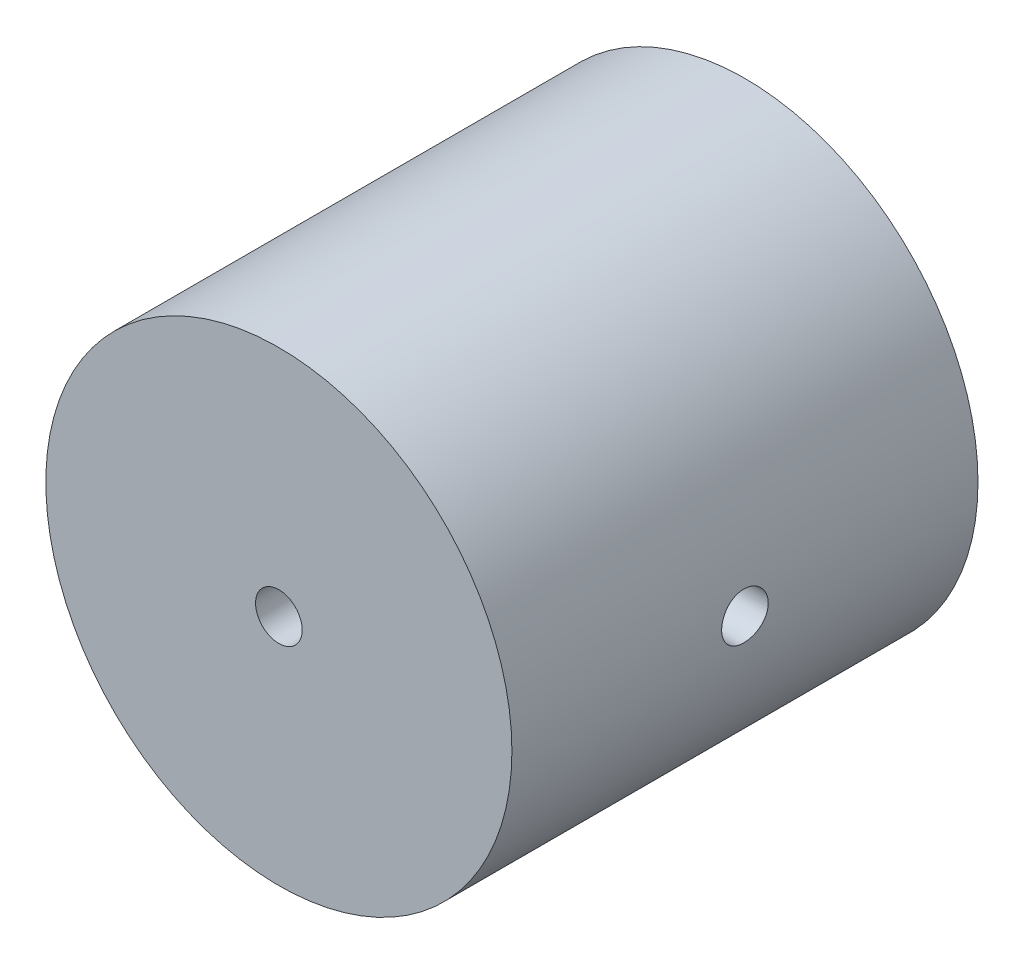
ISO-10303-21;
HEADER;
FILE_DESCRIPTION(('STEP AP214'),'2;1');
FILE_NAME('part.step','',(''),(''),'','','');
FILE_SCHEMA(('AUTOMOTIVE_DESIGN { 1 0 10303 214 1 1 1 1 }'));
ENDSEC;
DATA;
#1=APPLICATION_CONTEXT('core data for automotive mechanical design processes');
#2=APPLICATION_PROTOCOL_DEFINITION('international standard','automotive_design',2000,#1);
#3=PRODUCT_CONTEXT('',#1,'mechanical');
#4=PRODUCT('Part','Part','',(#3));
#5=PRODUCT_RELATED_PRODUCT_CATEGORY('part','',(#4));
#6=PRODUCT_DEFINITION_FORMATION('','',#4);
#7=PRODUCT_DEFINITION_CONTEXT('part definition',#1,'design');
#8=PRODUCT_DEFINITION('design','',#6,#7);
#9=PRODUCT_DEFINITION_SHAPE('','',#8);
#10=(LENGTH_UNIT() NAMED_UNIT(*) SI_UNIT(.MILLI.,.METRE.));
#11=(NAMED_UNIT(*) PLANE_ANGLE_UNIT() SI_UNIT($,.RADIAN.));
#12=(NAMED_UNIT(*) SI_UNIT($,.STERADIAN.) SOLID_ANGLE_UNIT());
#13=UNCERTAINTY_MEASURE_WITH_UNIT(LENGTH_MEASURE(1.E-05),#10,'distance_accuracy_value','');
#14=(GEOMETRIC_REPRESENTATION_CONTEXT(3) GLOBAL_UNCERTAINTY_ASSIGNED_CONTEXT((#13)) GLOBAL_UNIT_ASSIGNED_CONTEXT((#10,
#11,#12)) REPRESENTATION_CONTEXT('',''));
#15=CARTESIAN_POINT('',(0.,0.,0.));
#16=DIRECTION('',(0.,0.,1.));
#17=DIRECTION('',(1.,0.,0.));
#18=AXIS2_PLACEMENT_3D('',#15,#16,#17);
#19=CARTESIAN_POINT('',(0.,0.,4.75));
#20=DIRECTION('',(0.,0.,1.));
#21=DIRECTION('',(1.,0.,0.));
#22=AXIS2_PLACEMENT_3D('',#19,#20,#21);
#23=PLANE('',#22);
#24=CARTESIAN_POINT('',(0.,0.,4.75));
#25=DIRECTION('',(0.,0.,1.));
#26=DIRECTION('',(1.,0.,0.));
#27=AXIS2_PLACEMENT_3D('',#24,#25,#26);
#28=CIRCLE('',#27,0.5);
#29=CARTESIAN_POINT('',(0.5,0.,4.75));
#30=VERTEX_POINT('',#29);
#31=EDGE_CURVE('E132',#30,#30,#28,.T.);
#32=ORIENTED_EDGE('',*,*,#31,.F.);
#33=EDGE_LOOP('',(#32));
#34=FACE_BOUND('',#33,.T.);
#35=CARTESIAN_POINT('',(0.,0.,4.75));
#36=DIRECTION('',(0.,0.,1.));
#37=DIRECTION('',(1.,0.,0.));
#38=AXIS2_PLACEMENT_3D('',#35,#36,#37);
#39=CIRCLE('',#38,4.49999999999988);
#40=CARTESIAN_POINT('',(-3.50000000000012,-2.82842712474584,4.75000000000001));
#41=VERTEX_POINT('',#40);
#42=CARTESIAN_POINT('',(3.49999999999988,-2.82842712474615,4.75));
#43=VERTEX_POINT('',#42);
#44=EDGE_CURVE('E11',#41,#43,#39,.T.);
#45=ORIENTED_EDGE('',*,*,#44,.T.);
#46=DIRECTION('',(0.,1.,0.));
#47=VECTOR('',#46,1.);
#48=CARTESIAN_POINT('',(3.49999999999988,0.,4.75));
#49=LINE('',#48,#47);
#50=CARTESIAN_POINT('',(3.49999999999988,2.82842712474615,4.75000000000001));
#51=VERTEX_POINT('',#50);
#52=EDGE_CURVE('E101',#43,#51,#49,.T.);
#53=ORIENTED_EDGE('',*,*,#52,.T.);
#54=CARTESIAN_POINT('',(0.,0.,4.75));
#55=DIRECTION('',(0.,0.,1.));
#56=DIRECTION('',(1.,0.,0.));
#57=AXIS2_PLACEMENT_3D('',#54,#55,#56);
#58=CIRCLE('',#57,4.49999999999988);
#59=CARTESIAN_POINT('',(-3.50000000000012,2.82842712474584,4.75000000000001));
#60=VERTEX_POINT('',#59);
#61=EDGE_CURVE('E61',#51,#60,#58,.T.);
#62=ORIENTED_EDGE('',*,*,#61,.T.);
#63=DIRECTION('',(0.,1.,0.));
#64=VECTOR('',#63,1.);
#65=CARTESIAN_POINT('',(-3.50000000000012,0.,4.75));
#66=LINE('',#65,#64);
#67=EDGE_CURVE('E69',#41,#60,#66,.T.);
#68=ORIENTED_EDGE('',*,*,#67,.F.);
#69=EDGE_LOOP('',(#45,#53,#62,#68));
#70=FACE_BOUND('',#69,.T.);
#71=ADVANCED_FACE('F43',(#34,#70),#23,.T.);
#72=CARTESIAN_POINT('',(0.,0.,10.75));
#73=DIRECTION('',(0.,0.,-1.));
#74=DIRECTION('',(1.,0.,0.));
#75=AXIS2_PLACEMENT_3D('',#72,#73,#74);
#76=PLANE('',#75);
#77=CARTESIAN_POINT('',(0.,0.,10.75));
#78=DIRECTION('',(0.,0.,-1.));
#79=DIRECTION('',(-1.,0.,0.));
#80=AXIS2_PLACEMENT_3D('',#77,#78,#79);
#81=CIRCLE('',#80,0.5);
#82=CARTESIAN_POINT('',(-0.5,0.,10.75));
#83=VERTEX_POINT('',#82);
#84=EDGE_CURVE('E139',#83,#83,#81,.T.);
#85=ORIENTED_EDGE('',*,*,#84,.F.);
#86=EDGE_LOOP('',(#85));
#87=FACE_BOUND('',#86,.T.);
#88=DIRECTION('',(0.,-1.,0.));
#89=VECTOR('',#88,1.);
#90=CARTESIAN_POINT('',(3.49999999999988,0.,10.75));
#91=LINE('',#90,#89);
#92=CARTESIAN_POINT('',(3.49999999999988,2.82842712474615,10.75));
#93=VERTEX_POINT('',#92);
#94=CARTESIAN_POINT('',(3.49999999999988,-2.82842712474615,10.75));
#95=VERTEX_POINT('',#94);
#96=EDGE_CURVE('E113',#93,#95,#91,.T.);
#97=ORIENTED_EDGE('',*,*,#96,.T.);
#98=CARTESIAN_POINT('',(0.,0.,10.75));
#99=DIRECTION('',(0.,0.,-1.));
#100=DIRECTION('',(-1.,0.,0.));
#101=AXIS2_PLACEMENT_3D('',#98,#99,#100);
#102=CIRCLE('',#101,4.49999999999988);
#103=CARTESIAN_POINT('',(-3.50000000000012,-2.82842712474584,10.75));
#104=VERTEX_POINT('',#103);
#105=EDGE_CURVE('E94',#95,#104,#102,.T.);
#106=ORIENTED_EDGE('',*,*,#105,.T.);
#107=DIRECTION('',(0.,-1.,0.));
#108=VECTOR('',#107,1.);
#109=CARTESIAN_POINT('',(-3.50000000000012,0.,10.75));
#110=LINE('',#109,#108);
#111=CARTESIAN_POINT('',(-3.50000000000012,2.82842712474584,10.75));
#112=VERTEX_POINT('',#111);
#113=EDGE_CURVE('E117',#112,#104,#110,.T.);
#114=ORIENTED_EDGE('',*,*,#113,.F.);
#115=CARTESIAN_POINT('',(0.,0.,10.75));
#116=DIRECTION('',(0.,0.,-1.));
#117=DIRECTION('',(-1.,0.,0.));
#118=AXIS2_PLACEMENT_3D('',#115,#116,#117);
#119=CIRCLE('',#118,4.49999999999988);
#120=EDGE_CURVE('E115',#112,#93,#119,.T.);
#121=ORIENTED_EDGE('',*,*,#120,.T.);
#122=EDGE_LOOP('',(#97,#106,#114,#121));
#123=FACE_BOUND('',#122,.T.);
#124=ADVANCED_FACE('F178',(#87,#123),#76,.T.);
#125=CARTESIAN_POINT('',(0.,0.,24.8921356237306));
#126=DIRECTION('',(0.,0.,-1.));
#127=DIRECTION('',(-1.,0.,0.));
#128=AXIS2_PLACEMENT_3D('',#125,#126,#127);
#129=CYLINDRICAL_SURFACE('',#128,4.49999999999988);
#130=ORIENTED_EDGE('',*,*,#44,.F.);
#131=DIRECTION('',(0.,0.,-1.));
#132=VECTOR('',#131,1.);
#133=CARTESIAN_POINT('',(-3.50000000000012,-2.82842712474584,24.8921356237306));
#134=LINE('',#133,#132);
#135=EDGE_CURVE('E118',#104,#41,#134,.T.);
#136=ORIENTED_EDGE('',*,*,#135,.F.);
#137=ORIENTED_EDGE('',*,*,#105,.F.);
#138=DIRECTION('',(0.,0.,-1.));
#139=VECTOR('',#138,1.);
#140=CARTESIAN_POINT('',(3.49999999999988,-2.82842712474615,24.8921356237306));
#141=LINE('',#140,#139);
#142=EDGE_CURVE('E90',#95,#43,#141,.T.);
#143=ORIENTED_EDGE('',*,*,#142,.T.);
#144=EDGE_LOOP('',(#130,#136,#137,#143));
#145=FACE_BOUND('',#144,.T.);
#146=ADVANCED_FACE('F92',(#145),#129,.F.);
#147=CARTESIAN_POINT('',(-3.50000000000012,0.,24.8921356237306));
#148=DIRECTION('',(-1.,0.,0.));
#149=DIRECTION('',(0.,0.,1.));
#150=AXIS2_PLACEMENT_3D('',#147,#148,#149);
#151=PLANE('',#150);
#152=CARTESIAN_POINT('',(-3.50000000000013,0.,7.75));
#153=DIRECTION('',(-1.,0.,0.));
#154=DIRECTION('',(0.,0.,1.));
#155=AXIS2_PLACEMENT_3D('',#152,#153,#154);
#156=CIRCLE('',#155,0.500000000000001);
#157=CARTESIAN_POINT('',(-3.50000000000013,0.,8.25));
#158=VERTEX_POINT('',#157);
#159=EDGE_CURVE('E131',#158,#158,#156,.T.);
#160=ORIENTED_EDGE('',*,*,#159,.T.);
#161=EDGE_LOOP('',(#160));
#162=FACE_BOUND('',#161,.T.);
#163=ORIENTED_EDGE('',*,*,#135,.T.);
#164=ORIENTED_EDGE('',*,*,#67,.T.);
#165=DIRECTION('',(0.,0.,-1.));
#166=VECTOR('',#165,1.);
#167=CARTESIAN_POINT('',(-3.50000000000012,2.82842712474584,24.8921356237306));
#168=LINE('',#167,#166);
#169=EDGE_CURVE('E125',#112,#60,#168,.T.);
#170=ORIENTED_EDGE('',*,*,#169,.F.);
#171=ORIENTED_EDGE('',*,*,#113,.T.);
#172=EDGE_LOOP('',(#163,#164,#170,#171));
#173=FACE_BOUND('',#172,.T.);
#174=ADVANCED_FACE('F190',(#162,#173),#151,.F.);
#175=CARTESIAN_POINT('',(0.,0.,24.8921356237306));
#176=DIRECTION('',(0.,0.,-1.));
#177=DIRECTION('',(-1.,0.,0.));
#178=AXIS2_PLACEMENT_3D('',#175,#176,#177);
#179=CYLINDRICAL_SURFACE('',#178,4.49999999999988);
#180=ORIENTED_EDGE('',*,*,#61,.F.);
#181=DIRECTION('',(0.,0.,-1.));
#182=VECTOR('',#181,1.);
#183=CARTESIAN_POINT('',(3.49999999999988,2.82842712474615,24.8921356237306));
#184=LINE('',#183,#182);
#185=EDGE_CURVE('E97',#93,#51,#184,.T.);
#186=ORIENTED_EDGE('',*,*,#185,.F.);
#187=ORIENTED_EDGE('',*,*,#120,.F.);
#188=ORIENTED_EDGE('',*,*,#169,.T.);
#189=EDGE_LOOP('',(#180,#186,#187,#188));
#190=FACE_BOUND('',#189,.T.);
#191=ADVANCED_FACE('F186',(#190),#179,.F.);
#192=CARTESIAN_POINT('',(3.49999999999988,0.,24.8921356237306));
#193=DIRECTION('',(-1.,0.,0.));
#194=DIRECTION('',(0.,0.,1.));
#195=AXIS2_PLACEMENT_3D('',#192,#193,#194);
#196=PLANE('',#195);
#197=CARTESIAN_POINT('',(3.49999999999988,0.,7.75));
#198=DIRECTION('',(-1.,0.,0.));
#199=DIRECTION('',(0.,0.,1.));
#200=AXIS2_PLACEMENT_3D('',#197,#198,#199);
#201=CIRCLE('',#200,0.500000000000001);
#202=CARTESIAN_POINT('',(3.49999999999988,0.,8.25));
#203=VERTEX_POINT('',#202);
#204=EDGE_CURVE('E129',#203,#203,#201,.T.);
#205=ORIENTED_EDGE('',*,*,#204,.F.);
#206=EDGE_LOOP('',(#205));
#207=FACE_BOUND('',#206,.T.);
#208=ORIENTED_EDGE('',*,*,#52,.F.);
#209=ORIENTED_EDGE('',*,*,#142,.F.);
#210=ORIENTED_EDGE('',*,*,#96,.F.);
#211=ORIENTED_EDGE('',*,*,#185,.T.);
#212=EDGE_LOOP('',(#208,#209,#210,#211));
#213=FACE_BOUND('',#212,.T.);
#214=ADVANCED_FACE('F102',(#207,#213),#196,.T.);
#215=CARTESIAN_POINT('',(99.9999999999999,0.,7.74999999999998));
#216=DIRECTION('',(-1.,0.,0.));
#217=DIRECTION('',(0.,0.,1.));
#218=AXIS2_PLACEMENT_3D('',#215,#216,#217);
#219=CYLINDRICAL_SURFACE('',#218,0.500000000000001);
#220=ORIENTED_EDGE('',*,*,#204,.T.);
#221=EDGE_LOOP('',(#220));
#222=FACE_BOUND('',#221,.T.);
#223=CARTESIAN_POINT('',(4.99999999999988,0.,8.25));
#224=CARTESIAN_POINT('',(4.99999967760373,0.0280101768957787,8.24999878704981));
#225=CARTESIAN_POINT('',(4.99976212798091,0.0560388725838867,8.24763836555178));
#226=CARTESIAN_POINT('',(4.99883733797357,0.111319199248419,8.23825781485479));
#227=CARTESIAN_POINT('',(4.99814960217001,0.138569939584414,8.2312325519877));
#228=CARTESIAN_POINT('',(4.99640207281523,0.191485837726708,8.21272887970108));
#229=CARTESIAN_POINT('',(4.99534250400342,0.217151942307455,8.20125315974076));
#230=CARTESIAN_POINT('',(4.99296978697141,0.266188080480204,8.17417954603418));
#231=CARTESIAN_POINT('',(4.99165668919054,0.289558569389539,8.15858247199993));
#232=CARTESIAN_POINT('',(4.9889187217065,0.333429775337042,8.12364865116886));
#233=CARTESIAN_POINT('',(4.98749350786921,0.353921072417448,8.10430010029898));
#234=CARTESIAN_POINT('',(4.98469478453119,0.391371260715494,8.06243773286848));
#235=CARTESIAN_POINT('',(4.98332127742446,0.408329988541328,8.0399237699788));
#236=CARTESIAN_POINT('',(4.9807779577638,0.43826698522181,7.99231073415819));
#237=CARTESIAN_POINT('',(4.9796085835544,0.451236732727441,7.96720627795257));
#238=CARTESIAN_POINT('',(4.9776101877325,0.472773192371381,7.91516220704751));
#239=CARTESIAN_POINT('',(4.97678115771099,0.481340013295647,7.88822263770802));
#240=CARTESIAN_POINT('',(4.97556042036477,0.493799520800948,7.83336909956699));
#241=CARTESIAN_POINT('',(4.97516725199036,0.497707826501898,7.80545871157389));
#242=CARTESIAN_POINT('',(4.97485821530251,0.500787642567681,7.74937556830211));
#243=CARTESIAN_POINT('',(4.97494233444361,0.499959277435401,7.72120281993897));
#244=CARTESIAN_POINT('',(4.97557703449455,0.49360214012634,7.66550234515334));
#245=CARTESIAN_POINT('',(4.97612592295313,0.488090422062276,7.63797265033565));
#246=CARTESIAN_POINT('',(4.97762567143697,0.472549572075294,7.58423101839945));
#247=CARTESIAN_POINT('',(4.97857653689234,0.462520379127873,7.55801909908748));
#248=CARTESIAN_POINT('',(4.98077504726023,0.438210446940754,7.50760320635055));
#249=CARTESIAN_POINT('',(4.98202321954067,0.42392214135999,7.48340290525534));
#250=CARTESIAN_POINT('',(4.98467525866427,0.391505013676614,7.43773739254406));
#251=CARTESIAN_POINT('',(4.9860791300638,0.373376079168253,7.41627226100912));
#252=CARTESIAN_POINT('',(4.98889192656483,0.333697056206035,7.37658730300548));
#253=CARTESIAN_POINT('',(4.99030084666487,0.312132239425682,7.3583821990596));
#254=CARTESIAN_POINT('',(4.99295914539247,0.266244740868556,7.3258481835448));
#255=CARTESIAN_POINT('',(4.99420852384116,0.2419220559998,7.31151927632176));
#256=CARTESIAN_POINT('',(4.99640737833536,0.191199052846182,7.28714498984487));
#257=CARTESIAN_POINT('',(4.99735680207373,0.164798373194951,7.27710035759097));
#258=CARTESIAN_POINT('',(4.99884823720692,0.110673608664965,7.26159054164412));
#259=CARTESIAN_POINT('',(4.9993902607852,0.0829495633882996,7.25612522100469));
#260=CARTESIAN_POINT('',(5.00000425834143,0.0270925495459513,7.24994784613262));
#261=CARTESIAN_POINT('',(5.00007824133856,-0.00103815105274658,7.24921547587375));
#262=CARTESIAN_POINT('',(4.99975320878386,-0.0570218966578505,7.25247143152438));
#263=CARTESIAN_POINT('',(4.99935419962222,-0.0848749454102356,7.25645969365764));
#264=CARTESIAN_POINT('',(4.99812930769585,-0.139454103417338,7.26902684771079));
#265=CARTESIAN_POINT('',(4.99730430959008,-0.16618242448601,7.277596227239));
#266=CARTESIAN_POINT('',(4.99531999430293,-0.217822160691892,7.29907258701863));
#267=CARTESIAN_POINT('',(4.99416066962615,-0.242733535078559,7.3119796645197));
#268=CARTESIAN_POINT('',(4.99163237665199,-0.290124090086072,7.34181541933196));
#269=CARTESIAN_POINT('',(4.99026271801708,-0.312594829874459,7.35875744446291));
#270=CARTESIAN_POINT('',(4.98746966434748,-0.35438081165594,7.39616303387046));
#271=CARTESIAN_POINT('',(4.98604626796474,-0.373695974424589,7.41662668653516));
#272=CARTESIAN_POINT('',(4.98330012070365,-0.408693054943573,7.4605832873295));
#273=CARTESIAN_POINT('',(4.98197775069476,-0.424361639339772,7.48408687827131));
#274=CARTESIAN_POINT('',(4.97958916230433,-0.451529129371914,7.53340368007334));
#275=CARTESIAN_POINT('',(4.97852294042007,-0.463028092026942,7.5592168593442));
#276=CARTESIAN_POINT('',(4.97676973817013,-0.481507604342238,7.6123743697329));
#277=CARTESIAN_POINT('',(4.97608209224882,-0.488496087405932,7.63971592004556));
#278=CARTESIAN_POINT('',(4.97516182641426,-0.497782003564732,7.69519159898039));
#279=CARTESIAN_POINT('',(4.97492919345081,-0.500079571199759,7.72332570484784));
#280=CARTESIAN_POINT('',(4.97494556553769,-0.499916569235629,7.77945534417835));
#281=CARTESIAN_POINT('',(4.97519245043492,-0.497476944796557,7.80745094144141));
#282=CARTESIAN_POINT('',(4.97613551944761,-0.487952726481827,7.86263245858414));
#283=CARTESIAN_POINT('',(4.97683170406847,-0.48086812738108,7.88981837755299));
#284=CARTESIAN_POINT('',(4.97859434131581,-0.462260843148752,7.94260867452393));
#285=CARTESIAN_POINT('',(4.97966074270168,-0.450738772170459,7.96821327081486));
#286=CARTESIAN_POINT('',(4.98204375919667,-0.423585777455523,8.01712844583552));
#287=CARTESIAN_POINT('',(4.98336037290463,-0.407954876727708,8.04043903741031));
#288=CARTESIAN_POINT('',(4.98610243604837,-0.372949278142667,8.08421183723597));
#289=CARTESIAN_POINT('',(4.98752832363363,-0.353558974445135,8.10466153818354));
#290=CARTESIAN_POINT('',(4.99032427364379,-0.311615849612556,8.14202611634983));
#291=CARTESIAN_POINT('',(4.99169432261476,-0.28906227205413,8.15894014567858));
#292=CARTESIAN_POINT('',(4.99422781034569,-0.241370717080646,8.18878672692731));
#293=CARTESIAN_POINT('',(4.99539072013394,-0.216226374673383,8.20170914547259));
#294=CARTESIAN_POINT('',(4.99737314624936,-0.164129139550276,8.22313121141193));
#295=CARTESIAN_POINT('',(4.99819304954815,-0.137178324912805,8.23163584547678));
#296=CARTESIAN_POINT('',(4.99919106886855,-0.0917291307028525,8.2418603085424));
#297=CARTESIAN_POINT('',(4.99949300345904,-0.0735212764222545,8.24490852214968));
#298=CARTESIAN_POINT('',(4.99989757475381,-0.0368782904086564,8.24897876303088));
#299=CARTESIAN_POINT('',(5.00000021228,-0.0184431596132789,8.25000079866093));
#300=CARTESIAN_POINT('',(4.99999999999988,0.,8.25));
#301=B_SPLINE_CURVE_WITH_KNOTS('',3,(#223,#224,#225,#226,#227,#228,#229,#230,#231,#232,#233,
#234,#235,#236,#237,#238,#239,#240,#241,#242,#243,#244,#245,#246,#247,#248,#249,#250,#251,#252,
#253,#254,#255,#256,#257,#258,#259,#260,#261,#262,#263,#264,#265,#266,#267,#268,#269,#270,#271,
#272,#273,#274,#275,#276,#277,#278,#279,#280,#281,#282,#283,#284,#285,#286,#287,#288,#289,#290,
#291,#292,#293,#294,#295,#296,#297,#298,#299,#300),.UNSPECIFIED.,.T.,.F.,(4,2,2,2,2,2,2,2,2,2,2,
2,2,2,2,2,2,2,2,2,2,2,2,2,2,2,2,2,2,2,2,2,2,2,2,2,2,2,4),(0.,0.0839631831342372,
0.168018921417744,0.252023942866102,0.336012268791392,0.420269284311475,0.504530196103531,
0.588969877361112,0.673407472212523,0.757561160225985,0.841712636278884,0.925558987205556,
1.00940647080817,1.09340380686448,1.17740360165563,1.26177367098104,1.34614383489886,
1.43052870346791,1.5149110483772,1.59893094303879,1.68294970259572,1.76679467647153,
1.85064153024734,1.93476970374349,2.01889998905115,2.10333321804299,2.18776529237687,
2.27204845296502,2.35632919619793,2.44023814646979,2.5241471911302,2.608044626814,
2.6919415926948,2.77619458713827,2.86046776318479,2.94495315513121,3.02934297397648,
3.08462833616175,3.13991347034514),.UNSPECIFIED.);
#302=CARTESIAN_POINT('',(4.99999999999988,0.,8.25));
#303=VERTEX_POINT('',#302);
#304=EDGE_CURVE('E136',#303,#303,#301,.T.);
#305=ORIENTED_EDGE('',*,*,#304,.F.);
#306=EDGE_LOOP('',(#305));
#307=FACE_BOUND('',#306,.T.);
#308=ADVANCED_FACE('F163',(#222,#307),#219,.F.);
#309=ORIENTED_EDGE('',*,*,#159,.F.);
#310=EDGE_LOOP('',(#309));
#311=FACE_BOUND('',#310,.T.);
#312=CARTESIAN_POINT('',(-4.99999999999988,0.,7.25));
#313=CARTESIAN_POINT('',(-4.99999967760373,0.0280101768957787,7.25000121295019));
#314=CARTESIAN_POINT('',(-4.99976212798091,0.0560388725838866,7.25236163444822));
#315=CARTESIAN_POINT('',(-4.99883733797357,0.111319199248419,7.26174218514521));
#316=CARTESIAN_POINT('',(-4.99814960217001,0.138569939584414,7.26876744801229));
#317=CARTESIAN_POINT('',(-4.99640207281523,0.191485837726707,7.28727112029892));
#318=CARTESIAN_POINT('',(-4.99534250400342,0.217151942307455,7.29874684025924));
#319=CARTESIAN_POINT('',(-4.99296978697141,0.266188080480203,7.32582045396582));
#320=CARTESIAN_POINT('',(-4.99165668919054,0.289558569389539,7.34141752800007));
#321=CARTESIAN_POINT('',(-4.9889187217065,0.333429775337042,7.37635134883114));
#322=CARTESIAN_POINT('',(-4.98749350786921,0.353921072417447,7.39569989970102));
#323=CARTESIAN_POINT('',(-4.98469478453119,0.391371260715493,7.43756226713151));
#324=CARTESIAN_POINT('',(-4.98332127742446,0.408329988541327,7.46007623002119));
#325=CARTESIAN_POINT('',(-4.9807779577638,0.438266985221809,7.50768926584181));
#326=CARTESIAN_POINT('',(-4.9796085835544,0.45123673272744,7.53279372204743));
#327=CARTESIAN_POINT('',(-4.9776101877325,0.472773192371381,7.58483779295249));
#328=CARTESIAN_POINT('',(-4.97678115771099,0.481340013295646,7.61177736229198));
#329=CARTESIAN_POINT('',(-4.97556042036477,0.493799520800948,7.66663090043301));
#330=CARTESIAN_POINT('',(-4.97516725199036,0.497707826501898,7.6945412884261));
#331=CARTESIAN_POINT('',(-4.97485821530251,0.500787642567681,7.75062443169789));
#332=CARTESIAN_POINT('',(-4.97494233444361,0.499959277435401,7.77879718006103));
#333=CARTESIAN_POINT('',(-4.97557703449455,0.49360214012634,7.83449765484666));
#334=CARTESIAN_POINT('',(-4.97612592295313,0.488090422062277,7.86202734966435));
#335=CARTESIAN_POINT('',(-4.97762567143697,0.472549572075294,7.91576898160055));
#336=CARTESIAN_POINT('',(-4.97857653689234,0.462520379127873,7.94198090091252));
#337=CARTESIAN_POINT('',(-4.98077504726023,0.438210446940754,7.99239679364945));
#338=CARTESIAN_POINT('',(-4.98202321954067,0.423922141359991,8.01659709474466));
#339=CARTESIAN_POINT('',(-4.98467525866427,0.391505013676615,8.06226260745594));
#340=CARTESIAN_POINT('',(-4.9860791300638,0.373376079168254,8.08372773899088));
#341=CARTESIAN_POINT('',(-4.98889192656483,0.333697056206035,8.12341269699451));
#342=CARTESIAN_POINT('',(-4.99030084666487,0.312132239425682,8.1416178009404));
#343=CARTESIAN_POINT('',(-4.99295914539247,0.266244740868556,8.1741518164552));
#344=CARTESIAN_POINT('',(-4.99420852384116,0.2419220559998,8.18848072367824));
#345=CARTESIAN_POINT('',(-4.99640737833536,0.191199052846183,8.21285501015513));
#346=CARTESIAN_POINT('',(-4.99735680207373,0.164798373194952,8.22289964240903));
#347=CARTESIAN_POINT('',(-4.99884823720692,0.110673608664967,8.23840945835588));
#348=CARTESIAN_POINT('',(-4.9993902607852,0.0829495633883011,8.24387477899531));
#349=CARTESIAN_POINT('',(-5.00000425834143,0.0270925495459526,8.25005215386738));
#350=CARTESIAN_POINT('',(-5.00007824133856,-0.00103815105274545,8.25078452412625));
#351=CARTESIAN_POINT('',(-4.99975320878386,-0.0570218966578497,8.24752856847562));
#352=CARTESIAN_POINT('',(-4.99935419962222,-0.0848749454102348,8.24354030634236));
#353=CARTESIAN_POINT('',(-4.99812930769585,-0.139454103417337,8.23097315228921));
#354=CARTESIAN_POINT('',(-4.99730430959008,-0.16618242448601,8.22240377276099));
#355=CARTESIAN_POINT('',(-4.99531999430293,-0.217822160691891,8.20092741298136));
#356=CARTESIAN_POINT('',(-4.99416066962615,-0.242733535078558,8.1880203354803));
#357=CARTESIAN_POINT('',(-4.99163237665199,-0.290124090086071,8.15818458066804));
#358=CARTESIAN_POINT('',(-4.99026271801708,-0.312594829874459,8.14124255553709));
#359=CARTESIAN_POINT('',(-4.98746966434748,-0.35438081165594,8.10383696612954));
#360=CARTESIAN_POINT('',(-4.98604626796474,-0.373695974424589,8.08337331346484));
#361=CARTESIAN_POINT('',(-4.98330012070365,-0.408693054943573,8.0394167126705));
#362=CARTESIAN_POINT('',(-4.98197775069476,-0.424361639339772,8.01591312172869));
#363=CARTESIAN_POINT('',(-4.97958916230433,-0.451529129371914,7.96659631992666));
#364=CARTESIAN_POINT('',(-4.97852294042007,-0.463028092026942,7.9407831406558));
#365=CARTESIAN_POINT('',(-4.97676973817013,-0.481507604342238,7.88762563026711));
#366=CARTESIAN_POINT('',(-4.97608209224882,-0.488496087405931,7.86028407995444));
#367=CARTESIAN_POINT('',(-4.97516182641426,-0.497782003564732,7.80480840101961));
#368=CARTESIAN_POINT('',(-4.97492919345081,-0.500079571199759,7.77667429515216));
#369=CARTESIAN_POINT('',(-4.97494556553769,-0.499916569235629,7.72054465582165));
#370=CARTESIAN_POINT('',(-4.97519245043492,-0.497476944796557,7.69254905855859));
#371=CARTESIAN_POINT('',(-4.97613551944761,-0.487952726481827,7.63736754141586));
#372=CARTESIAN_POINT('',(-4.97683170406847,-0.480868127381081,7.61018162244701));
#373=CARTESIAN_POINT('',(-4.97859434131581,-0.462260843148752,7.55739132547607));
#374=CARTESIAN_POINT('',(-4.97966074270168,-0.450738772170459,7.53178672918514));
#375=CARTESIAN_POINT('',(-4.98204375919667,-0.423585777455523,7.48287155416448));
#376=CARTESIAN_POINT('',(-4.98336037290463,-0.407954876727708,7.45956096258969));
#377=CARTESIAN_POINT('',(-4.98610243604837,-0.372949278142666,7.41578816276403));
#378=CARTESIAN_POINT('',(-4.98752832363363,-0.353558974445135,7.39533846181646));
#379=CARTESIAN_POINT('',(-4.99032427364379,-0.311615849612556,7.35797388365017));
#380=CARTESIAN_POINT('',(-4.99169432261476,-0.289062272054129,7.34105985432141));
#381=CARTESIAN_POINT('',(-4.99422781034569,-0.241370717080645,7.31121327307269));
#382=CARTESIAN_POINT('',(-4.99539072013394,-0.216226374673383,7.29829085452741));
#383=CARTESIAN_POINT('',(-4.99737314624936,-0.164129139550276,7.27686878858807));
#384=CARTESIAN_POINT('',(-4.99819304954815,-0.137178324912805,7.26836415452323));
#385=CARTESIAN_POINT('',(-4.99919106886855,-0.0917291307028524,7.2581396914576));
#386=CARTESIAN_POINT('',(-4.99949300345904,-0.0735212764222546,7.25509147785032));
#387=CARTESIAN_POINT('',(-4.99989757475381,-0.0368782904086566,7.25102123696912));
#388=CARTESIAN_POINT('',(-5.00000021228,-0.018443159613279,7.24999920133907));
#389=CARTESIAN_POINT('',(-4.99999999999988,0.,7.25));
#390=B_SPLINE_CURVE_WITH_KNOTS('',3,(#312,#313,#314,#315,#316,#317,#318,#319,#320,#321,#322,
#323,#324,#325,#326,#327,#328,#329,#330,#331,#332,#333,#334,#335,#336,#337,#338,#339,#340,#341,
#342,#343,#344,#345,#346,#347,#348,#349,#350,#351,#352,#353,#354,#355,#356,#357,#358,#359,#360,
#361,#362,#363,#364,#365,#366,#367,#368,#369,#370,#371,#372,#373,#374,#375,#376,#377,#378,#379,
#380,#381,#382,#383,#384,#385,#386,#387,#388,#389),.UNSPECIFIED.,.T.,.F.,(4,2,2,2,2,2,2,2,2,2,2,
2,2,2,2,2,2,2,2,2,2,2,2,2,2,2,2,2,2,2,2,2,2,2,2,2,2,2,4),(0.,0.083963183134237,
0.168018921417743,0.252023942866101,0.336012268791392,0.420269284311473,0.50453019610353,
0.58896987736111,0.673407472212521,0.757561160225984,0.841712636278884,0.925558987205554,
1.00940647080817,1.09340380686447,1.17740360165563,1.26177367098103,1.34614383489886,
1.43052870346791,1.5149110483772,1.59893094303879,1.68294970259572,1.76679467647153,
1.85064153024734,1.93476970374349,2.01889998905115,2.103333218043,2.18776529237687,
2.27204845296502,2.35632919619793,2.44023814646978,2.5241471911302,2.608044626814,
2.6919415926948,2.77619458713827,2.86046776318479,2.94495315513121,3.02934297397648,
3.08462833616175,3.13991347034514),.UNSPECIFIED.);
#391=CARTESIAN_POINT('',(-4.99999999999988,0.,7.25));
#392=VERTEX_POINT('',#391);
#393=EDGE_CURVE('E154',#392,#392,#390,.T.);
#394=ORIENTED_EDGE('',*,*,#393,.F.);
#395=EDGE_LOOP('',(#394));
#396=FACE_BOUND('',#395,.T.);
#397=ADVANCED_FACE('F158',(#311,#396),#219,.F.);
#398=CARTESIAN_POINT('',(0.,0.,10.75));
#399=DIRECTION('',(0.,0.,1.));
#400=DIRECTION('',(-1.,0.,0.));
#401=AXIS2_PLACEMENT_3D('',#398,#399,#400);
#402=CYLINDRICAL_SURFACE('',#401,4.99999999999988);
#403=ORIENTED_EDGE('',*,*,#393,.T.);
#404=EDGE_LOOP('',(#403));
#405=FACE_BOUND('',#404,.T.);
#406=ORIENTED_EDGE('',*,*,#304,.T.);
#407=EDGE_LOOP('',(#406));
#408=FACE_BOUND('',#407,.T.);
#409=CARTESIAN_POINT('',(0.,0.,12.75));
#410=DIRECTION('',(0.,0.,1.));
#411=DIRECTION('',(1.,0.,0.));
#412=AXIS2_PLACEMENT_3D('',#409,#410,#411);
#413=CIRCLE('',#412,4.99999999999988);
#414=CARTESIAN_POINT('',(4.99999999999988,0.,12.75));
#415=VERTEX_POINT('',#414);
#416=EDGE_CURVE('E53',#415,#415,#413,.T.);
#417=ORIENTED_EDGE('',*,*,#416,.F.);
#418=EDGE_LOOP('',(#417));
#419=FACE_BOUND('',#418,.T.);
#420=CARTESIAN_POINT('',(0.,0.,2.75));
#421=DIRECTION('',(0.,0.,1.));
#422=DIRECTION('',(1.,0.,0.));
#423=AXIS2_PLACEMENT_3D('',#420,#421,#422);
#424=CIRCLE('',#423,4.99999999999988);
#425=CARTESIAN_POINT('',(4.99999999999988,0.,2.75));
#426=VERTEX_POINT('',#425);
#427=EDGE_CURVE('E98',#426,#426,#424,.T.);
#428=ORIENTED_EDGE('',*,*,#427,.T.);
#429=EDGE_LOOP('',(#428));
#430=FACE_BOUND('',#429,.T.);
#431=ADVANCED_FACE('F45',(#405,#408,#419,#430),#402,.T.);
#432=CARTESIAN_POINT('',(0.,0.,12.75));
#433=DIRECTION('',(0.,0.,-1.));
#434=DIRECTION('',(1.,0.,0.));
#435=AXIS2_PLACEMENT_3D('',#432,#433,#434);
#436=PLANE('',#435);
#437=CARTESIAN_POINT('',(0.,0.,12.75));
#438=DIRECTION('',(0.,0.,-1.));
#439=DIRECTION('',(-1.,0.,0.));
#440=AXIS2_PLACEMENT_3D('',#437,#438,#439);
#441=CIRCLE('',#440,0.5);
#442=CARTESIAN_POINT('',(-0.5,0.,12.75));
#443=VERTEX_POINT('',#442);
#444=EDGE_CURVE('E144',#443,#443,#441,.T.);
#445=ORIENTED_EDGE('',*,*,#444,.T.);
#446=EDGE_LOOP('',(#445));
#447=FACE_BOUND('',#446,.T.);
#448=ORIENTED_EDGE('',*,*,#416,.T.);
#449=EDGE_LOOP('',(#448));
#450=FACE_BOUND('',#449,.T.);
#451=ADVANCED_FACE('F182',(#447,#450),#436,.F.);
#452=CARTESIAN_POINT('',(0.,0.,2.75));
#453=DIRECTION('',(0.,0.,1.));
#454=DIRECTION('',(1.,0.,0.));
#455=AXIS2_PLACEMENT_3D('',#452,#453,#454);
#456=PLANE('',#455);
#457=CARTESIAN_POINT('',(0.,0.,2.75));
#458=DIRECTION('',(0.,0.,1.));
#459=DIRECTION('',(1.,0.,0.));
#460=AXIS2_PLACEMENT_3D('',#457,#458,#459);
#461=CIRCLE('',#460,2.50000000000012);
#462=CARTESIAN_POINT('',(2.50000000000012,0.,2.75));
#463=VERTEX_POINT('',#462);
#464=EDGE_CURVE('E109',#463,#463,#461,.T.);
#465=ORIENTED_EDGE('',*,*,#464,.T.);
#466=EDGE_LOOP('',(#465));
#467=FACE_BOUND('',#466,.T.);
#468=ORIENTED_EDGE('',*,*,#427,.F.);
#469=EDGE_LOOP('',(#468));
#470=FACE_BOUND('',#469,.T.);
#471=ADVANCED_FACE('F174',(#467,#470),#456,.F.);
#472=CARTESIAN_POINT('',(0.,0.,1.75));
#473=DIRECTION('',(0.,0.,1.));
#474=DIRECTION('',(1.,0.,0.));
#475=AXIS2_PLACEMENT_3D('',#472,#473,#474);
#476=CYLINDRICAL_SURFACE('',#475,2.50000000000012);
#477=CARTESIAN_POINT('',(0.,0.,1.75));
#478=DIRECTION('',(0.,0.,1.));
#479=DIRECTION('',(1.,0.,0.));
#480=AXIS2_PLACEMENT_3D('',#477,#478,#479);
#481=CIRCLE('',#480,2.50000000000012);
#482=CARTESIAN_POINT('',(2.50000000000012,0.,1.75));
#483=VERTEX_POINT('',#482);
#484=EDGE_CURVE('E105',#483,#483,#481,.T.);
#485=ORIENTED_EDGE('',*,*,#484,.T.);
#486=EDGE_LOOP('',(#485));
#487=FACE_BOUND('',#486,.T.);
#488=ORIENTED_EDGE('',*,*,#464,.F.);
#489=EDGE_LOOP('',(#488));
#490=FACE_BOUND('',#489,.T.);
#491=ADVANCED_FACE('F170',(#487,#490),#476,.T.);
#492=CARTESIAN_POINT('',(0.,0.,1.75));
#493=DIRECTION('',(0.,0.,1.));
#494=DIRECTION('',(1.,0.,0.));
#495=AXIS2_PLACEMENT_3D('',#492,#493,#494);
#496=PLANE('',#495);
#497=CARTESIAN_POINT('',(0.,0.,1.75));
#498=DIRECTION('',(0.,0.,1.));
#499=DIRECTION('',(1.,0.,0.));
#500=AXIS2_PLACEMENT_3D('',#497,#498,#499);
#501=CIRCLE('',#500,0.5);
#502=CARTESIAN_POINT('',(0.5,0.,1.75));
#503=VERTEX_POINT('',#502);
#504=EDGE_CURVE('E48',#503,#503,#501,.T.);
#505=ORIENTED_EDGE('',*,*,#504,.T.);
#506=EDGE_LOOP('',(#505));
#507=FACE_BOUND('',#506,.T.);
#508=ORIENTED_EDGE('',*,*,#484,.F.);
#509=EDGE_LOOP('',(#508));
#510=FACE_BOUND('',#509,.T.);
#511=ADVANCED_FACE('F166',(#507,#510),#496,.F.);
#512=CARTESIAN_POINT('',(0.,0.,-135.25));
#513=DIRECTION('',(0.,0.,1.));
#514=DIRECTION('',(1.,0.,0.));
#515=AXIS2_PLACEMENT_3D('',#512,#513,#514);
#516=CYLINDRICAL_SURFACE('',#515,0.5);
#517=ORIENTED_EDGE('',*,*,#31,.T.);
#518=EDGE_LOOP('',(#517));
#519=FACE_BOUND('',#518,.T.);
#520=ORIENTED_EDGE('',*,*,#504,.F.);
#521=EDGE_LOOP('',(#520));
#522=FACE_BOUND('',#521,.T.);
#523=ADVANCED_FACE('F165',(#519,#522),#516,.F.);
#524=ORIENTED_EDGE('',*,*,#84,.T.);
#525=EDGE_LOOP('',(#524));
#526=FACE_BOUND('',#525,.T.);
#527=ORIENTED_EDGE('',*,*,#444,.F.);
#528=EDGE_LOOP('',(#527));
#529=FACE_BOUND('',#528,.T.);
#530=ADVANCED_FACE('F220',(#526,#529),#516,.F.);
#531=CLOSED_SHELL('',(#71,#124,#146,#174,#191,#214,#308,#397,#431,#451,#471,#491,#511,#523,#530));
#532=MANIFOLD_SOLID_BREP('B2',#531);
#533=ADVANCED_BREP_SHAPE_REPRESENTATION('',(#18,#532),#14);
#534=SHAPE_DEFINITION_REPRESENTATION(#9,#533);
ENDSEC;
END-ISO-10303-21;
